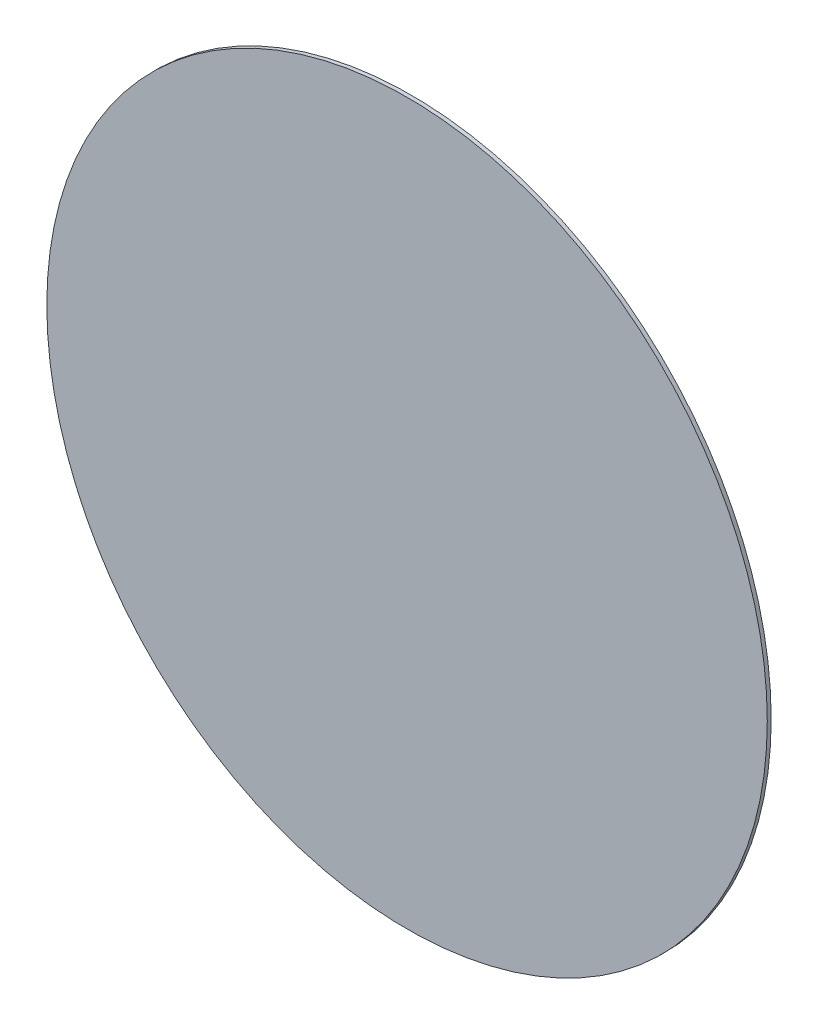
ISO-10303-21;
HEADER;
FILE_DESCRIPTION(('STEP AP214'),'2;1');
FILE_NAME('part.step','',(''),(''),'','','');
FILE_SCHEMA(('AUTOMOTIVE_DESIGN { 1 0 10303 214 1 1 1 1 }'));
ENDSEC;
DATA;
#1=APPLICATION_CONTEXT('core data for automotive mechanical design processes');
#2=APPLICATION_PROTOCOL_DEFINITION('international standard','automotive_design',2000,#1);
#3=PRODUCT_CONTEXT('',#1,'mechanical');
#4=PRODUCT('Part','Part','',(#3));
#5=PRODUCT_RELATED_PRODUCT_CATEGORY('part','',(#4));
#6=PRODUCT_DEFINITION_FORMATION('','',#4);
#7=PRODUCT_DEFINITION_CONTEXT('part definition',#1,'design');
#8=PRODUCT_DEFINITION('design','',#6,#7);
#9=PRODUCT_DEFINITION_SHAPE('','',#8);
#10=(LENGTH_UNIT() NAMED_UNIT(*) SI_UNIT(.MILLI.,.METRE.));
#11=(NAMED_UNIT(*) PLANE_ANGLE_UNIT() SI_UNIT($,.RADIAN.));
#12=(NAMED_UNIT(*) SI_UNIT($,.STERADIAN.) SOLID_ANGLE_UNIT());
#13=UNCERTAINTY_MEASURE_WITH_UNIT(LENGTH_MEASURE(1.E-05),#10,'distance_accuracy_value','');
#14=(GEOMETRIC_REPRESENTATION_CONTEXT(3) GLOBAL_UNCERTAINTY_ASSIGNED_CONTEXT((#13)) GLOBAL_UNIT_ASSIGNED_CONTEXT((#10,
#11,#12)) REPRESENTATION_CONTEXT('',''));
#15=CARTESIAN_POINT('',(0.,0.,0.));
#16=DIRECTION('',(0.,0.,1.));
#17=DIRECTION('',(1.,0.,0.));
#18=AXIS2_PLACEMENT_3D('',#15,#16,#17);
#19=CARTESIAN_POINT('',(0.,0.,0.2));
#20=DIRECTION('',(0.,0.,-1.));
#21=DIRECTION('',(-1.,0.,0.));
#22=AXIS2_PLACEMENT_3D('',#19,#20,#21);
#23=CYLINDRICAL_SURFACE('',#22,18.5);
#24=CARTESIAN_POINT('',(0.,0.,0.2));
#25=DIRECTION('',(0.,0.,1.));
#26=DIRECTION('',(1.,0.,0.));
#27=AXIS2_PLACEMENT_3D('',#24,#25,#26);
#28=CIRCLE('',#27,18.5);
#29=CARTESIAN_POINT('',(18.5,0.,0.2));
#30=VERTEX_POINT('',#29);
#31=EDGE_CURVE('E10',#30,#30,#28,.T.);
#32=ORIENTED_EDGE('',*,*,#31,.F.);
#33=EDGE_LOOP('',(#32));
#34=FACE_BOUND('',#33,.T.);
#35=CARTESIAN_POINT('',(0.,0.,0.));
#36=DIRECTION('',(0.,0.,1.));
#37=DIRECTION('',(1.,0.,0.));
#38=AXIS2_PLACEMENT_3D('',#35,#36,#37);
#39=CIRCLE('',#38,18.5);
#40=CARTESIAN_POINT('',(18.5,0.,0.));
#41=VERTEX_POINT('',#40);
#42=EDGE_CURVE('E34',#41,#41,#39,.T.);
#43=ORIENTED_EDGE('',*,*,#42,.T.);
#44=EDGE_LOOP('',(#43));
#45=FACE_BOUND('',#44,.T.);
#46=ADVANCED_FACE('F31',(#34,#45),#23,.T.);
#47=CARTESIAN_POINT('',(0.,0.,0.2));
#48=DIRECTION('',(0.,0.,1.));
#49=DIRECTION('',(1.,0.,0.));
#50=AXIS2_PLACEMENT_3D('',#47,#48,#49);
#51=PLANE('',#50);
#52=ORIENTED_EDGE('',*,*,#31,.T.);
#53=EDGE_LOOP('',(#52));
#54=FACE_BOUND('',#53,.T.);
#55=ADVANCED_FACE('F46',(#54),#51,.T.);
#56=CARTESIAN_POINT('',(0.,0.,0.));
#57=DIRECTION('',(0.,0.,1.));
#58=DIRECTION('',(1.,0.,0.));
#59=AXIS2_PLACEMENT_3D('',#56,#57,#58);
#60=PLANE('',#59);
#61=ORIENTED_EDGE('',*,*,#42,.F.);
#62=EDGE_LOOP('',(#61));
#63=FACE_BOUND('',#62,.T.);
#64=ADVANCED_FACE('F44',(#63),#60,.F.);
#65=CLOSED_SHELL('',(#46,#55,#64));
#66=MANIFOLD_SOLID_BREP('B2',#65);
#67=ADVANCED_BREP_SHAPE_REPRESENTATION('',(#18,#66),#14);
#68=SHAPE_DEFINITION_REPRESENTATION(#9,#67);
ENDSEC;
END-ISO-10303-21;
